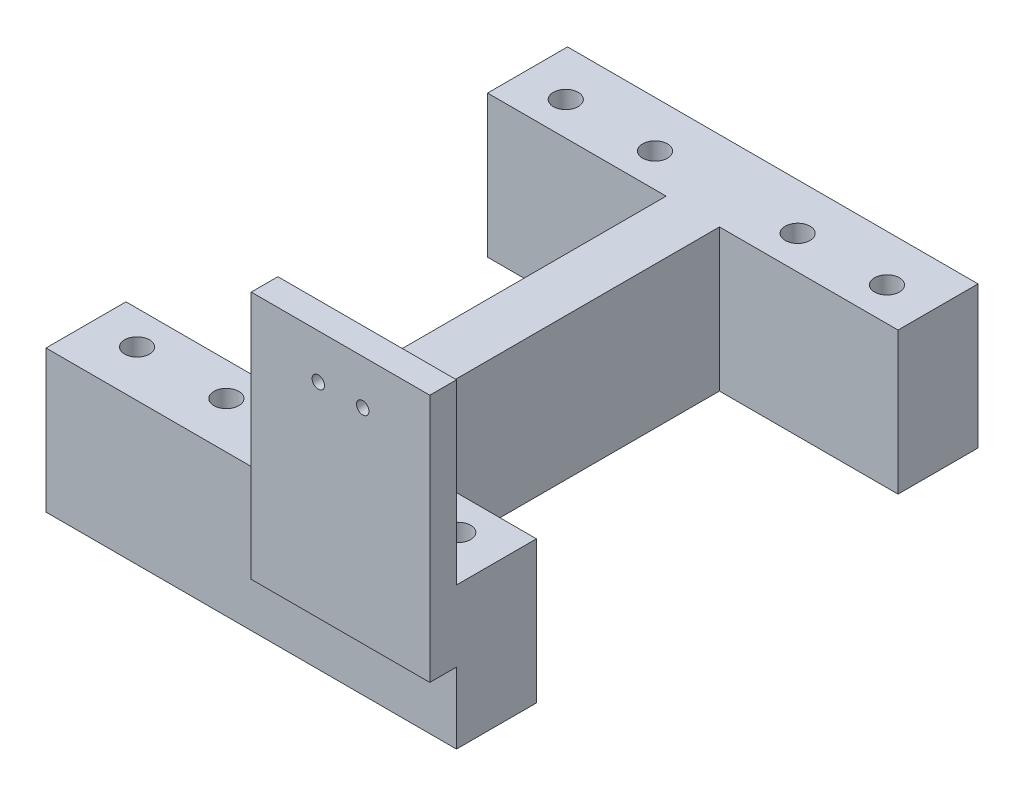
ISO-10303-21;
HEADER;
FILE_DESCRIPTION(('STEP AP214'),'2;1');
FILE_NAME('part.step','',(''),(''),'','','');
FILE_SCHEMA(('AUTOMOTIVE_DESIGN { 1 0 10303 214 1 1 1 1 }'));
ENDSEC;
DATA;
#1=APPLICATION_CONTEXT('core data for automotive mechanical design processes');
#2=APPLICATION_PROTOCOL_DEFINITION('international standard','automotive_design',2000,#1);
#3=PRODUCT_CONTEXT('',#1,'mechanical');
#4=PRODUCT('Part','Part','',(#3));
#5=PRODUCT_RELATED_PRODUCT_CATEGORY('part','',(#4));
#6=PRODUCT_DEFINITION_FORMATION('','',#4);
#7=PRODUCT_DEFINITION_CONTEXT('part definition',#1,'design');
#8=PRODUCT_DEFINITION('design','',#6,#7);
#9=PRODUCT_DEFINITION_SHAPE('','',#8);
#10=(LENGTH_UNIT() NAMED_UNIT(*) SI_UNIT(.MILLI.,.METRE.));
#11=(NAMED_UNIT(*) PLANE_ANGLE_UNIT() SI_UNIT($,.RADIAN.));
#12=(NAMED_UNIT(*) SI_UNIT($,.STERADIAN.) SOLID_ANGLE_UNIT());
#13=UNCERTAINTY_MEASURE_WITH_UNIT(LENGTH_MEASURE(1.E-05),#10,'distance_accuracy_value','');
#14=(GEOMETRIC_REPRESENTATION_CONTEXT(3) GLOBAL_UNCERTAINTY_ASSIGNED_CONTEXT((#13)) GLOBAL_UNIT_ASSIGNED_CONTEXT((#10,
#11,#12)) REPRESENTATION_CONTEXT('',''));
#15=CARTESIAN_POINT('',(0.,0.,0.));
#16=DIRECTION('',(0.,0.,1.));
#17=DIRECTION('',(1.,0.,0.));
#18=AXIS2_PLACEMENT_3D('',#15,#16,#17);
#19=CARTESIAN_POINT('',(0.,-8.,29.35));
#20=DIRECTION('',(0.,0.,1.));
#21=DIRECTION('',(1.,0.,0.));
#22=AXIS2_PLACEMENT_3D('',#19,#20,#21);
#23=PLANE('',#22);
#24=DIRECTION('',(0.,1.,0.));
#25=VECTOR('',#24,1.);
#26=CARTESIAN_POINT('',(10.05,-8.,29.35));
#27=LINE('',#26,#25);
#28=CARTESIAN_POINT('',(10.05,-8.,29.35));
#29=VERTEX_POINT('',#28);
#30=CARTESIAN_POINT('',(10.05,0.,29.35));
#31=VERTEX_POINT('',#30);
#32=EDGE_CURVE('E57',#29,#31,#27,.T.);
#33=ORIENTED_EDGE('',*,*,#32,.T.);
#34=DIRECTION('',(-1.,0.,0.));
#35=VECTOR('',#34,1.);
#36=CARTESIAN_POINT('',(0.,0.,29.35));
#37=LINE('',#36,#35);
#38=CARTESIAN_POINT('',(-10.05,0.,29.35));
#39=VERTEX_POINT('',#38);
#40=EDGE_CURVE('E348',#31,#39,#37,.T.);
#41=ORIENTED_EDGE('',*,*,#40,.T.);
#42=DIRECTION('',(0.,-1.,0.));
#43=VECTOR('',#42,1.);
#44=CARTESIAN_POINT('',(-10.05,28.,29.35));
#45=LINE('',#44,#43);
#46=CARTESIAN_POINT('',(-10.05,8.,29.35));
#47=VERTEX_POINT('',#46);
#48=EDGE_CURVE('E11',#47,#39,#45,.T.);
#49=ORIENTED_EDGE('',*,*,#48,.F.);
#50=DIRECTION('',(1.,0.,0.));
#51=VECTOR('',#50,1.);
#52=CARTESIAN_POINT('',(0.,8.,29.35));
#53=LINE('',#52,#51);
#54=CARTESIAN_POINT('',(-36.15,8.,29.35));
#55=VERTEX_POINT('',#54);
#56=EDGE_CURVE('E189',#55,#47,#53,.T.);
#57=ORIENTED_EDGE('',*,*,#56,.F.);
#58=DIRECTION('',(0.,1.,0.));
#59=VECTOR('',#58,1.);
#60=CARTESIAN_POINT('',(-36.15,-8.,29.35));
#61=LINE('',#60,#59);
#62=CARTESIAN_POINT('',(-36.15,-8.,29.35));
#63=VERTEX_POINT('',#62);
#64=EDGE_CURVE('E311',#63,#55,#61,.T.);
#65=ORIENTED_EDGE('',*,*,#64,.F.);
#66=DIRECTION('',(1.,0.,0.));
#67=VECTOR('',#66,1.);
#68=CARTESIAN_POINT('',(0.,-8.,29.35));
#69=LINE('',#68,#67);
#70=EDGE_CURVE('E247',#63,#29,#69,.T.);
#71=ORIENTED_EDGE('',*,*,#70,.T.);
#72=EDGE_LOOP('',(#33,#41,#49,#57,#65,#71));
#73=FACE_BOUND('',#72,.T.);
#74=ADVANCED_FACE('F35',(#73),#23,.T.);
#75=CARTESIAN_POINT('',(0.,-8.,20.35));
#76=DIRECTION('',(0.,0.,1.));
#77=DIRECTION('',(1.,0.,0.));
#78=AXIS2_PLACEMENT_3D('',#75,#76,#77);
#79=PLANE('',#78);
#80=DIRECTION('',(0.,1.,0.));
#81=VECTOR('',#80,1.);
#82=CARTESIAN_POINT('',(-36.15,-8.,20.35));
#83=LINE('',#82,#81);
#84=CARTESIAN_POINT('',(-36.15,-8.,20.35));
#85=VERTEX_POINT('',#84);
#86=CARTESIAN_POINT('',(-36.15,8.,20.35));
#87=VERTEX_POINT('',#86);
#88=EDGE_CURVE('E39',#85,#87,#83,.T.);
#89=ORIENTED_EDGE('',*,*,#88,.T.);
#90=DIRECTION('',(1.,0.,0.));
#91=VECTOR('',#90,1.);
#92=CARTESIAN_POINT('',(0.,8.,20.35));
#93=LINE('',#92,#91);
#94=CARTESIAN_POINT('',(-16.05,8.,20.35));
#95=VERTEX_POINT('',#94);
#96=EDGE_CURVE('E179',#87,#95,#93,.T.);
#97=ORIENTED_EDGE('',*,*,#96,.T.);
#98=DIRECTION('',(0.,1.,0.));
#99=VECTOR('',#98,1.);
#100=CARTESIAN_POINT('',(-16.05,-8.,20.35));
#101=LINE('',#100,#99);
#102=CARTESIAN_POINT('',(-16.05,-8.,20.35));
#103=VERTEX_POINT('',#102);
#104=EDGE_CURVE('E44',#103,#95,#101,.T.);
#105=ORIENTED_EDGE('',*,*,#104,.F.);
#106=DIRECTION('',(1.,0.,0.));
#107=VECTOR('',#106,1.);
#108=CARTESIAN_POINT('',(0.,-8.,20.35));
#109=LINE('',#108,#107);
#110=EDGE_CURVE('E241',#85,#103,#109,.T.);
#111=ORIENTED_EDGE('',*,*,#110,.F.);
#112=EDGE_LOOP('',(#89,#97,#105,#111));
#113=FACE_BOUND('',#112,.T.);
#114=ADVANCED_FACE('F37',(#113),#79,.F.);
#115=CARTESIAN_POINT('',(-16.05,-8.,0.));
#116=DIRECTION('',(1.,0.,0.));
#117=DIRECTION('',(0.,0.,-1.));
#118=AXIS2_PLACEMENT_3D('',#115,#116,#117);
#119=PLANE('',#118);
#120=ORIENTED_EDGE('',*,*,#104,.T.);
#121=DIRECTION('',(0.,0.,-1.));
#122=VECTOR('',#121,1.);
#123=CARTESIAN_POINT('',(-16.05,8.,0.));
#124=LINE('',#123,#122);
#125=CARTESIAN_POINT('',(-16.05,8.,-20.35));
#126=VERTEX_POINT('',#125);
#127=EDGE_CURVE('E214',#95,#126,#124,.T.);
#128=ORIENTED_EDGE('',*,*,#127,.T.);
#129=DIRECTION('',(0.,1.,0.));
#130=VECTOR('',#129,1.);
#131=CARTESIAN_POINT('',(-16.05,-8.,-20.35));
#132=LINE('',#131,#130);
#133=CARTESIAN_POINT('',(-16.05,-8.,-20.35));
#134=VERTEX_POINT('',#133);
#135=EDGE_CURVE('E295',#134,#126,#132,.T.);
#136=ORIENTED_EDGE('',*,*,#135,.F.);
#137=DIRECTION('',(0.,0.,-1.));
#138=VECTOR('',#137,1.);
#139=CARTESIAN_POINT('',(-16.05,-8.,0.));
#140=LINE('',#139,#138);
#141=EDGE_CURVE('E268',#103,#134,#140,.T.);
#142=ORIENTED_EDGE('',*,*,#141,.F.);
#143=EDGE_LOOP('',(#120,#128,#136,#142));
#144=FACE_BOUND('',#143,.T.);
#145=ADVANCED_FACE('F328',(#144),#119,.F.);
#146=CARTESIAN_POINT('',(0.,-8.,-20.35));
#147=DIRECTION('',(0.,0.,1.));
#148=DIRECTION('',(1.,0.,0.));
#149=AXIS2_PLACEMENT_3D('',#146,#147,#148);
#150=PLANE('',#149);
#151=ORIENTED_EDGE('',*,*,#135,.T.);
#152=DIRECTION('',(1.,0.,0.));
#153=VECTOR('',#152,1.);
#154=CARTESIAN_POINT('',(0.,8.,-20.35));
#155=LINE('',#154,#153);
#156=CARTESIAN_POINT('',(-36.15,8.,-20.35));
#157=VERTEX_POINT('',#156);
#158=EDGE_CURVE('E211',#157,#126,#155,.T.);
#159=ORIENTED_EDGE('',*,*,#158,.F.);
#160=DIRECTION('',(0.,1.,0.));
#161=VECTOR('',#160,1.);
#162=CARTESIAN_POINT('',(-36.15,-8.,-20.35));
#163=LINE('',#162,#161);
#164=CARTESIAN_POINT('',(-36.15,-8.,-20.35));
#165=VERTEX_POINT('',#164);
#166=EDGE_CURVE('E297',#165,#157,#163,.T.);
#167=ORIENTED_EDGE('',*,*,#166,.F.);
#168=DIRECTION('',(1.,0.,0.));
#169=VECTOR('',#168,1.);
#170=CARTESIAN_POINT('',(0.,-8.,-20.35));
#171=LINE('',#170,#169);
#172=EDGE_CURVE('E265',#165,#134,#171,.T.);
#173=ORIENTED_EDGE('',*,*,#172,.T.);
#174=EDGE_LOOP('',(#151,#159,#167,#173));
#175=FACE_BOUND('',#174,.T.);
#176=ADVANCED_FACE('F421',(#175),#150,.T.);
#177=CARTESIAN_POINT('',(-36.15,-8.,0.));
#178=DIRECTION('',(1.,0.,0.));
#179=DIRECTION('',(0.,0.,-1.));
#180=AXIS2_PLACEMENT_3D('',#177,#178,#179);
#181=PLANE('',#180);
#182=ORIENTED_EDGE('',*,*,#166,.T.);
#183=DIRECTION('',(0.,0.,-1.));
#184=VECTOR('',#183,1.);
#185=CARTESIAN_POINT('',(-36.15,8.,0.));
#186=LINE('',#185,#184);
#187=CARTESIAN_POINT('',(-36.15,8.,-29.35));
#188=VERTEX_POINT('',#187);
#189=EDGE_CURVE('E208',#157,#188,#186,.T.);
#190=ORIENTED_EDGE('',*,*,#189,.T.);
#191=DIRECTION('',(0.,1.,0.));
#192=VECTOR('',#191,1.);
#193=CARTESIAN_POINT('',(-36.15,-8.,-29.35));
#194=LINE('',#193,#192);
#195=CARTESIAN_POINT('',(-36.15,-8.,-29.35));
#196=VERTEX_POINT('',#195);
#197=EDGE_CURVE('E299',#196,#188,#194,.T.);
#198=ORIENTED_EDGE('',*,*,#197,.F.);
#199=DIRECTION('',(0.,0.,-1.));
#200=VECTOR('',#199,1.);
#201=CARTESIAN_POINT('',(-36.15,-8.,0.));
#202=LINE('',#201,#200);
#203=EDGE_CURVE('E263',#165,#196,#202,.T.);
#204=ORIENTED_EDGE('',*,*,#203,.F.);
#205=EDGE_LOOP('',(#182,#190,#198,#204));
#206=FACE_BOUND('',#205,.T.);
#207=ADVANCED_FACE('F424',(#206),#181,.F.);
#208=CARTESIAN_POINT('',(0.,-8.,-29.35));
#209=DIRECTION('',(0.,0.,1.));
#210=DIRECTION('',(1.,0.,0.));
#211=AXIS2_PLACEMENT_3D('',#208,#209,#210);
#212=PLANE('',#211);
#213=ORIENTED_EDGE('',*,*,#197,.T.);
#214=DIRECTION('',(1.,0.,0.));
#215=VECTOR('',#214,1.);
#216=CARTESIAN_POINT('',(0.,8.,-29.35));
#217=LINE('',#216,#215);
#218=CARTESIAN_POINT('',(10.05,8.,-29.35));
#219=VERTEX_POINT('',#218);
#220=EDGE_CURVE('E205',#188,#219,#217,.T.);
#221=ORIENTED_EDGE('',*,*,#220,.T.);
#222=DIRECTION('',(0.,1.,0.));
#223=VECTOR('',#222,1.);
#224=CARTESIAN_POINT('',(10.05,-8.,-29.35));
#225=LINE('',#224,#223);
#226=CARTESIAN_POINT('',(10.05,-8.,-29.35));
#227=VERTEX_POINT('',#226);
#228=EDGE_CURVE('E301',#227,#219,#225,.T.);
#229=ORIENTED_EDGE('',*,*,#228,.F.);
#230=DIRECTION('',(1.,0.,0.));
#231=VECTOR('',#230,1.);
#232=CARTESIAN_POINT('',(0.,-8.,-29.35));
#233=LINE('',#232,#231);
#234=EDGE_CURVE('E261',#196,#227,#233,.T.);
#235=ORIENTED_EDGE('',*,*,#234,.F.);
#236=EDGE_LOOP('',(#213,#221,#229,#235));
#237=FACE_BOUND('',#236,.T.);
#238=ADVANCED_FACE('F428',(#237),#212,.F.);
#239=CARTESIAN_POINT('',(10.05,-8.,0.));
#240=DIRECTION('',(1.,0.,0.));
#241=DIRECTION('',(0.,0.,-1.));
#242=AXIS2_PLACEMENT_3D('',#239,#240,#241);
#243=PLANE('',#242);
#244=ORIENTED_EDGE('',*,*,#228,.T.);
#245=DIRECTION('',(0.,0.,-1.));
#246=VECTOR('',#245,1.);
#247=CARTESIAN_POINT('',(10.05,8.,0.));
#248=LINE('',#247,#246);
#249=CARTESIAN_POINT('',(10.05,8.,-20.35));
#250=VERTEX_POINT('',#249);
#251=EDGE_CURVE('E202',#250,#219,#248,.T.);
#252=ORIENTED_EDGE('',*,*,#251,.F.);
#253=DIRECTION('',(0.,1.,0.));
#254=VECTOR('',#253,1.);
#255=CARTESIAN_POINT('',(10.05,-8.,-20.35));
#256=LINE('',#255,#254);
#257=CARTESIAN_POINT('',(10.05,-8.,-20.35));
#258=VERTEX_POINT('',#257);
#259=EDGE_CURVE('E303',#258,#250,#256,.T.);
#260=ORIENTED_EDGE('',*,*,#259,.F.);
#261=DIRECTION('',(0.,0.,-1.));
#262=VECTOR('',#261,1.);
#263=CARTESIAN_POINT('',(10.05,-8.,0.));
#264=LINE('',#263,#262);
#265=EDGE_CURVE('E258',#258,#227,#264,.T.);
#266=ORIENTED_EDGE('',*,*,#265,.T.);
#267=EDGE_LOOP('',(#244,#252,#260,#266));
#268=FACE_BOUND('',#267,.T.);
#269=ADVANCED_FACE('F432',(#268),#243,.T.);
#270=CARTESIAN_POINT('',(0.,-8.,-20.35));
#271=DIRECTION('',(0.,0.,1.));
#272=DIRECTION('',(1.,0.,0.));
#273=AXIS2_PLACEMENT_3D('',#270,#271,#272);
#274=PLANE('',#273);
#275=ORIENTED_EDGE('',*,*,#259,.T.);
#276=DIRECTION('',(1.,0.,0.));
#277=VECTOR('',#276,1.);
#278=CARTESIAN_POINT('',(0.,8.,-20.35));
#279=LINE('',#278,#277);
#280=CARTESIAN_POINT('',(-10.05,8.,-20.35));
#281=VERTEX_POINT('',#280);
#282=EDGE_CURVE('E199',#281,#250,#279,.T.);
#283=ORIENTED_EDGE('',*,*,#282,.F.);
#284=DIRECTION('',(0.,1.,0.));
#285=VECTOR('',#284,1.);
#286=CARTESIAN_POINT('',(-10.05,-8.,-20.35));
#287=LINE('',#286,#285);
#288=CARTESIAN_POINT('',(-10.05,-8.,-20.35));
#289=VERTEX_POINT('',#288);
#290=EDGE_CURVE('E305',#289,#281,#287,.T.);
#291=ORIENTED_EDGE('',*,*,#290,.F.);
#292=DIRECTION('',(1.,0.,0.));
#293=VECTOR('',#292,1.);
#294=CARTESIAN_POINT('',(0.,-8.,-20.35));
#295=LINE('',#294,#293);
#296=EDGE_CURVE('E255',#289,#258,#295,.T.);
#297=ORIENTED_EDGE('',*,*,#296,.T.);
#298=EDGE_LOOP('',(#275,#283,#291,#297));
#299=FACE_BOUND('',#298,.T.);
#300=ADVANCED_FACE('F436',(#299),#274,.T.);
#301=CARTESIAN_POINT('',(-10.05,-8.,0.));
#302=DIRECTION('',(-1.,0.,0.));
#303=DIRECTION('',(0.,0.,1.));
#304=AXIS2_PLACEMENT_3D('',#301,#302,#303);
#305=PLANE('',#304);
#306=ORIENTED_EDGE('',*,*,#290,.T.);
#307=DIRECTION('',(0.,0.,1.));
#308=VECTOR('',#307,1.);
#309=CARTESIAN_POINT('',(-10.05,8.,0.));
#310=LINE('',#309,#308);
#311=CARTESIAN_POINT('',(-10.05,8.,20.35));
#312=VERTEX_POINT('',#311);
#313=EDGE_CURVE('E196',#281,#312,#310,.T.);
#314=ORIENTED_EDGE('',*,*,#313,.T.);
#315=DIRECTION('',(0.,1.,0.));
#316=VECTOR('',#315,1.);
#317=CARTESIAN_POINT('',(-10.05,-8.,20.35));
#318=LINE('',#317,#316);
#319=CARTESIAN_POINT('',(-10.05,-8.,20.35));
#320=VERTEX_POINT('',#319);
#321=EDGE_CURVE('E307',#320,#312,#318,.T.);
#322=ORIENTED_EDGE('',*,*,#321,.F.);
#323=DIRECTION('',(0.,0.,1.));
#324=VECTOR('',#323,1.);
#325=CARTESIAN_POINT('',(-10.05,-8.,0.));
#326=LINE('',#325,#324);
#327=EDGE_CURVE('E253',#289,#320,#326,.T.);
#328=ORIENTED_EDGE('',*,*,#327,.F.);
#329=EDGE_LOOP('',(#306,#314,#322,#328));
#330=FACE_BOUND('',#329,.T.);
#331=ADVANCED_FACE('F440',(#330),#305,.F.);
#332=CARTESIAN_POINT('',(0.,-8.,20.35));
#333=DIRECTION('',(0.,0.,1.));
#334=DIRECTION('',(1.,0.,0.));
#335=AXIS2_PLACEMENT_3D('',#332,#333,#334);
#336=PLANE('',#335);
#337=ORIENTED_EDGE('',*,*,#321,.T.);
#338=DIRECTION('',(1.,0.,0.));
#339=VECTOR('',#338,1.);
#340=CARTESIAN_POINT('',(0.,8.,20.35));
#341=LINE('',#340,#339);
#342=CARTESIAN_POINT('',(10.05,8.,20.35));
#343=VERTEX_POINT('',#342);
#344=EDGE_CURVE('E193',#312,#343,#341,.T.);
#345=ORIENTED_EDGE('',*,*,#344,.T.);
#346=DIRECTION('',(0.,1.,0.));
#347=VECTOR('',#346,1.);
#348=CARTESIAN_POINT('',(10.05,-8.,20.35));
#349=LINE('',#348,#347);
#350=CARTESIAN_POINT('',(10.05,-8.,20.35));
#351=VERTEX_POINT('',#350);
#352=EDGE_CURVE('E309',#351,#343,#349,.T.);
#353=ORIENTED_EDGE('',*,*,#352,.F.);
#354=DIRECTION('',(1.,0.,0.));
#355=VECTOR('',#354,1.);
#356=CARTESIAN_POINT('',(0.,-8.,20.35));
#357=LINE('',#356,#355);
#358=EDGE_CURVE('E251',#320,#351,#357,.T.);
#359=ORIENTED_EDGE('',*,*,#358,.F.);
#360=EDGE_LOOP('',(#337,#345,#353,#359));
#361=FACE_BOUND('',#360,.T.);
#362=ADVANCED_FACE('F443',(#361),#336,.F.);
#363=CARTESIAN_POINT('',(10.05,-8.,0.));
#364=DIRECTION('',(-1.,0.,0.));
#365=DIRECTION('',(0.,0.,1.));
#366=AXIS2_PLACEMENT_3D('',#363,#364,#365);
#367=PLANE('',#366);
#368=ORIENTED_EDGE('',*,*,#352,.T.);
#369=DIRECTION('',(0.,0.,1.));
#370=VECTOR('',#369,1.);
#371=CARTESIAN_POINT('',(10.05,8.,0.));
#372=LINE('',#371,#370);
#373=CARTESIAN_POINT('',(10.05,8.,29.35));
#374=VERTEX_POINT('',#373);
#375=EDGE_CURVE('E191',#343,#374,#372,.T.);
#376=ORIENTED_EDGE('',*,*,#375,.T.);
#377=DIRECTION('',(0.,-1.,0.));
#378=VECTOR('',#377,1.);
#379=CARTESIAN_POINT('',(10.05,28.,29.35));
#380=LINE('',#379,#378);
#381=CARTESIAN_POINT('',(10.05,28.,29.35));
#382=VERTEX_POINT('',#381);
#383=EDGE_CURVE('E161',#382,#374,#380,.T.);
#384=ORIENTED_EDGE('',*,*,#383,.F.);
#385=DIRECTION('',(0.,0.,-1.));
#386=VECTOR('',#385,1.);
#387=CARTESIAN_POINT('',(10.05,28.,0.));
#388=LINE('',#387,#386);
#389=CARTESIAN_POINT('',(10.05,28.,32.35));
#390=VERTEX_POINT('',#389);
#391=EDGE_CURVE('E153',#390,#382,#388,.T.);
#392=ORIENTED_EDGE('',*,*,#391,.F.);
#393=DIRECTION('',(0.,-1.,0.));
#394=VECTOR('',#393,1.);
#395=CARTESIAN_POINT('',(10.05,28.,32.35));
#396=LINE('',#395,#394);
#397=CARTESIAN_POINT('',(10.05,0.,32.35));
#398=VERTEX_POINT('',#397);
#399=EDGE_CURVE('E157',#390,#398,#396,.T.);
#400=ORIENTED_EDGE('',*,*,#399,.T.);
#401=DIRECTION('',(0.,0.,-1.));
#402=VECTOR('',#401,1.);
#403=CARTESIAN_POINT('',(10.05,0.,0.));
#404=LINE('',#403,#402);
#405=EDGE_CURVE('E350',#398,#31,#404,.T.);
#406=ORIENTED_EDGE('',*,*,#405,.T.);
#407=ORIENTED_EDGE('',*,*,#32,.F.);
#408=DIRECTION('',(0.,0.,1.));
#409=VECTOR('',#408,1.);
#410=CARTESIAN_POINT('',(10.05,-8.,0.));
#411=LINE('',#410,#409);
#412=EDGE_CURVE('E249',#351,#29,#411,.T.);
#413=ORIENTED_EDGE('',*,*,#412,.F.);
#414=EDGE_LOOP('',(#368,#376,#384,#392,#400,#406,#407,#413));
#415=FACE_BOUND('',#414,.T.);
#416=ADVANCED_FACE('F155',(#415),#367,.F.);
#417=CARTESIAN_POINT('',(-31.125,-8.,-24.125));
#418=DIRECTION('',(0.,1.,0.));
#419=DIRECTION('',(0.,0.,1.));
#420=AXIS2_PLACEMENT_3D('',#417,#418,#419);
#421=CYLINDRICAL_SURFACE('',#420,1.4);
#422=CARTESIAN_POINT('',(-31.125,-8.,-24.125));
#423=DIRECTION('',(0.,1.,0.));
#424=DIRECTION('',(0.,0.,1.));
#425=AXIS2_PLACEMENT_3D('',#422,#423,#424);
#426=CIRCLE('',#425,1.4);
#427=CARTESIAN_POINT('',(-31.125,-8.,-22.725));
#428=VERTEX_POINT('',#427);
#429=EDGE_CURVE('E288',#428,#428,#426,.T.);
#430=ORIENTED_EDGE('',*,*,#429,.F.);
#431=EDGE_LOOP('',(#430));
#432=FACE_BOUND('',#431,.T.);
#433=CARTESIAN_POINT('',(-31.125,8.,-24.125));
#434=DIRECTION('',(0.,1.,0.));
#435=DIRECTION('',(0.,0.,1.));
#436=AXIS2_PLACEMENT_3D('',#433,#434,#435);
#437=CIRCLE('',#436,1.4);
#438=CARTESIAN_POINT('',(-31.125,8.,-22.725));
#439=VERTEX_POINT('',#438);
#440=EDGE_CURVE('E235',#439,#439,#437,.T.);
#441=ORIENTED_EDGE('',*,*,#440,.T.);
#442=EDGE_LOOP('',(#441));
#443=FACE_BOUND('',#442,.T.);
#444=ADVANCED_FACE('F450',(#432,#443),#421,.F.);
#445=CARTESIAN_POINT('',(5.025,-8.,-24.125));
#446=DIRECTION('',(0.,1.,0.));
#447=DIRECTION('',(0.,0.,1.));
#448=AXIS2_PLACEMENT_3D('',#445,#446,#447);
#449=CYLINDRICAL_SURFACE('',#448,1.4);
#450=CARTESIAN_POINT('',(5.025,-8.,-24.125));
#451=DIRECTION('',(0.,1.,0.));
#452=DIRECTION('',(0.,0.,1.));
#453=AXIS2_PLACEMENT_3D('',#450,#451,#452);
#454=CIRCLE('',#453,1.4);
#455=CARTESIAN_POINT('',(5.025,-8.,-22.725));
#456=VERTEX_POINT('',#455);
#457=EDGE_CURVE('E285',#456,#456,#454,.F.);
#458=ORIENTED_EDGE('',*,*,#457,.T.);
#459=EDGE_LOOP('',(#458));
#460=FACE_BOUND('',#459,.T.);
#461=CARTESIAN_POINT('',(5.025,8.,-24.125));
#462=DIRECTION('',(0.,1.,0.));
#463=DIRECTION('',(0.,0.,1.));
#464=AXIS2_PLACEMENT_3D('',#461,#462,#463);
#465=CIRCLE('',#464,1.4);
#466=CARTESIAN_POINT('',(5.025,8.,-22.725));
#467=VERTEX_POINT('',#466);
#468=EDGE_CURVE('E232',#467,#467,#465,.F.);
#469=ORIENTED_EDGE('',*,*,#468,.F.);
#470=EDGE_LOOP('',(#469));
#471=FACE_BOUND('',#470,.T.);
#472=ADVANCED_FACE('F590',(#460,#471),#449,.F.);
#473=CARTESIAN_POINT('',(-5.025,-8.,-24.125));
#474=DIRECTION('',(0.,1.,0.));
#475=DIRECTION('',(0.,0.,1.));
#476=AXIS2_PLACEMENT_3D('',#473,#474,#475);
#477=CYLINDRICAL_SURFACE('',#476,1.4);
#478=CARTESIAN_POINT('',(-5.025,-8.,-24.125));
#479=DIRECTION('',(0.,1.,0.));
#480=DIRECTION('',(0.,0.,1.));
#481=AXIS2_PLACEMENT_3D('',#478,#479,#480);
#482=CIRCLE('',#481,1.4);
#483=CARTESIAN_POINT('',(-5.025,-8.,-22.725));
#484=VERTEX_POINT('',#483);
#485=EDGE_CURVE('E282',#484,#484,#482,.T.);
#486=ORIENTED_EDGE('',*,*,#485,.F.);
#487=EDGE_LOOP('',(#486));
#488=FACE_BOUND('',#487,.T.);
#489=CARTESIAN_POINT('',(-5.025,8.,-24.125));
#490=DIRECTION('',(0.,1.,0.));
#491=DIRECTION('',(0.,0.,1.));
#492=AXIS2_PLACEMENT_3D('',#489,#490,#491);
#493=CIRCLE('',#492,1.4);
#494=CARTESIAN_POINT('',(-5.025,8.,-22.725));
#495=VERTEX_POINT('',#494);
#496=EDGE_CURVE('E229',#495,#495,#493,.T.);
#497=ORIENTED_EDGE('',*,*,#496,.T.);
#498=EDGE_LOOP('',(#497));
#499=FACE_BOUND('',#498,.T.);
#500=ADVANCED_FACE('F580',(#488,#499),#477,.F.);
#501=CARTESIAN_POINT('',(-5.025,-8.,24.125));
#502=DIRECTION('',(0.,1.,0.));
#503=DIRECTION('',(0.,0.,1.));
#504=AXIS2_PLACEMENT_3D('',#501,#502,#503);
#505=CYLINDRICAL_SURFACE('',#504,1.4);
#506=CARTESIAN_POINT('',(-5.025,-8.,24.125));
#507=DIRECTION('',(0.,1.,0.));
#508=DIRECTION('',(0.,0.,1.));
#509=AXIS2_PLACEMENT_3D('',#506,#507,#508);
#510=CIRCLE('',#509,1.4);
#511=CARTESIAN_POINT('',(-5.025,-8.,25.525));
#512=VERTEX_POINT('',#511);
#513=EDGE_CURVE('E279',#512,#512,#510,.F.);
#514=ORIENTED_EDGE('',*,*,#513,.T.);
#515=EDGE_LOOP('',(#514));
#516=FACE_BOUND('',#515,.T.);
#517=CARTESIAN_POINT('',(-5.025,8.,24.125));
#518=DIRECTION('',(0.,1.,0.));
#519=DIRECTION('',(0.,0.,1.));
#520=AXIS2_PLACEMENT_3D('',#517,#518,#519);
#521=CIRCLE('',#520,1.4);
#522=CARTESIAN_POINT('',(-5.025,8.,25.525));
#523=VERTEX_POINT('',#522);
#524=EDGE_CURVE('E226',#523,#523,#521,.F.);
#525=ORIENTED_EDGE('',*,*,#524,.F.);
#526=EDGE_LOOP('',(#525));
#527=FACE_BOUND('',#526,.T.);
#528=ADVANCED_FACE('F571',(#516,#527),#505,.F.);
#529=CARTESIAN_POINT('',(5.025,-8.,24.125));
#530=DIRECTION('',(0.,1.,0.));
#531=DIRECTION('',(0.,0.,1.));
#532=AXIS2_PLACEMENT_3D('',#529,#530,#531);
#533=CYLINDRICAL_SURFACE('',#532,1.4);
#534=CARTESIAN_POINT('',(5.025,-8.,24.125));
#535=DIRECTION('',(0.,1.,0.));
#536=DIRECTION('',(0.,0.,1.));
#537=AXIS2_PLACEMENT_3D('',#534,#535,#536);
#538=CIRCLE('',#537,1.4);
#539=CARTESIAN_POINT('',(5.025,-8.,25.525));
#540=VERTEX_POINT('',#539);
#541=EDGE_CURVE('E276',#540,#540,#538,.T.);
#542=ORIENTED_EDGE('',*,*,#541,.F.);
#543=EDGE_LOOP('',(#542));
#544=FACE_BOUND('',#543,.T.);
#545=CARTESIAN_POINT('',(5.025,8.,24.125));
#546=DIRECTION('',(0.,1.,0.));
#547=DIRECTION('',(0.,0.,1.));
#548=AXIS2_PLACEMENT_3D('',#545,#546,#547);
#549=CIRCLE('',#548,1.4);
#550=CARTESIAN_POINT('',(5.025,8.,25.525));
#551=VERTEX_POINT('',#550);
#552=EDGE_CURVE('E223',#551,#551,#549,.T.);
#553=ORIENTED_EDGE('',*,*,#552,.T.);
#554=EDGE_LOOP('',(#553));
#555=FACE_BOUND('',#554,.T.);
#556=ADVANCED_FACE('F412',(#544,#555),#533,.F.);
#557=CARTESIAN_POINT('',(-31.125,-8.,24.125));
#558=DIRECTION('',(0.,1.,0.));
#559=DIRECTION('',(0.,0.,1.));
#560=AXIS2_PLACEMENT_3D('',#557,#558,#559);
#561=CYLINDRICAL_SURFACE('',#560,1.4);
#562=CARTESIAN_POINT('',(-31.125,-8.,24.125));
#563=DIRECTION('',(0.,1.,0.));
#564=DIRECTION('',(0.,0.,1.));
#565=AXIS2_PLACEMENT_3D('',#562,#563,#564);
#566=CIRCLE('',#565,1.4);
#567=CARTESIAN_POINT('',(-31.125,-8.,25.525));
#568=VERTEX_POINT('',#567);
#569=EDGE_CURVE('E273',#568,#568,#566,.F.);
#570=ORIENTED_EDGE('',*,*,#569,.T.);
#571=EDGE_LOOP('',(#570));
#572=FACE_BOUND('',#571,.T.);
#573=CARTESIAN_POINT('',(-31.125,8.,24.125));
#574=DIRECTION('',(0.,1.,0.));
#575=DIRECTION('',(0.,0.,1.));
#576=AXIS2_PLACEMENT_3D('',#573,#574,#575);
#577=CIRCLE('',#576,1.4);
#578=CARTESIAN_POINT('',(-31.125,8.,25.525));
#579=VERTEX_POINT('',#578);
#580=EDGE_CURVE('E220',#579,#579,#577,.F.);
#581=ORIENTED_EDGE('',*,*,#580,.F.);
#582=EDGE_LOOP('',(#581));
#583=FACE_BOUND('',#582,.T.);
#584=ADVANCED_FACE('F406',(#572,#583),#561,.F.);
#585=CARTESIAN_POINT('',(-21.075,-8.,24.125));
#586=DIRECTION('',(0.,1.,0.));
#587=DIRECTION('',(0.,0.,1.));
#588=AXIS2_PLACEMENT_3D('',#585,#586,#587);
#589=CYLINDRICAL_SURFACE('',#588,1.4);
#590=CARTESIAN_POINT('',(-21.075,-8.,24.125));
#591=DIRECTION('',(0.,1.,0.));
#592=DIRECTION('',(0.,0.,1.));
#593=AXIS2_PLACEMENT_3D('',#590,#591,#592);
#594=CIRCLE('',#593,1.4);
#595=CARTESIAN_POINT('',(-21.075,-8.,25.525));
#596=VERTEX_POINT('',#595);
#597=EDGE_CURVE('E270',#596,#596,#594,.T.);
#598=ORIENTED_EDGE('',*,*,#597,.F.);
#599=EDGE_LOOP('',(#598));
#600=FACE_BOUND('',#599,.T.);
#601=CARTESIAN_POINT('',(-21.075,8.,24.125));
#602=DIRECTION('',(0.,1.,0.));
#603=DIRECTION('',(0.,0.,1.));
#604=AXIS2_PLACEMENT_3D('',#601,#602,#603);
#605=CIRCLE('',#604,1.4);
#606=CARTESIAN_POINT('',(-21.075,8.,25.525));
#607=VERTEX_POINT('',#606);
#608=EDGE_CURVE('E217',#607,#607,#605,.T.);
#609=ORIENTED_EDGE('',*,*,#608,.T.);
#610=EDGE_LOOP('',(#609));
#611=FACE_BOUND('',#610,.T.);
#612=ADVANCED_FACE('F399',(#600,#611),#589,.F.);
#613=CARTESIAN_POINT('',(-36.15,-8.,0.));
#614=DIRECTION('',(-1.,0.,0.));
#615=DIRECTION('',(0.,0.,1.));
#616=AXIS2_PLACEMENT_3D('',#613,#614,#615);
#617=PLANE('',#616);
#618=ORIENTED_EDGE('',*,*,#64,.T.);
#619=DIRECTION('',(0.,0.,1.));
#620=VECTOR('',#619,1.);
#621=CARTESIAN_POINT('',(-36.15,8.,0.));
#622=LINE('',#621,#620);
#623=EDGE_CURVE('E182',#87,#55,#622,.T.);
#624=ORIENTED_EDGE('',*,*,#623,.F.);
#625=ORIENTED_EDGE('',*,*,#88,.F.);
#626=DIRECTION('',(0.,0.,1.));
#627=VECTOR('',#626,1.);
#628=CARTESIAN_POINT('',(-36.15,-8.,0.));
#629=LINE('',#628,#627);
#630=EDGE_CURVE('E244',#85,#63,#629,.T.);
#631=ORIENTED_EDGE('',*,*,#630,.T.);
#632=EDGE_LOOP('',(#618,#624,#625,#631));
#633=FACE_BOUND('',#632,.T.);
#634=ADVANCED_FACE('F320',(#633),#617,.T.);
#635=CARTESIAN_POINT('',(-21.075,-8.,-24.125));
#636=DIRECTION('',(0.,1.,0.));
#637=DIRECTION('',(0.,0.,1.));
#638=AXIS2_PLACEMENT_3D('',#635,#636,#637);
#639=CYLINDRICAL_SURFACE('',#638,1.4);
#640=CARTESIAN_POINT('',(-21.075,-8.,-24.125));
#641=DIRECTION('',(0.,1.,0.));
#642=DIRECTION('',(0.,0.,1.));
#643=AXIS2_PLACEMENT_3D('',#640,#641,#642);
#644=CIRCLE('',#643,1.4);
#645=CARTESIAN_POINT('',(-21.075,-8.,-22.725));
#646=VERTEX_POINT('',#645);
#647=EDGE_CURVE('E291',#646,#646,#644,.F.);
#648=ORIENTED_EDGE('',*,*,#647,.T.);
#649=EDGE_LOOP('',(#648));
#650=FACE_BOUND('',#649,.T.);
#651=CARTESIAN_POINT('',(-21.075,8.,-24.125));
#652=DIRECTION('',(0.,1.,0.));
#653=DIRECTION('',(0.,0.,1.));
#654=AXIS2_PLACEMENT_3D('',#651,#652,#653);
#655=CIRCLE('',#654,1.4);
#656=CARTESIAN_POINT('',(-21.075,8.,-22.725));
#657=VERTEX_POINT('',#656);
#658=EDGE_CURVE('E238',#657,#657,#655,.F.);
#659=ORIENTED_EDGE('',*,*,#658,.F.);
#660=EDGE_LOOP('',(#659));
#661=FACE_BOUND('',#660,.T.);
#662=ADVANCED_FACE('F398',(#650,#661),#639,.F.);
#663=CARTESIAN_POINT('',(0.,-8.,0.));
#664=DIRECTION('',(0.,1.,0.));
#665=DIRECTION('',(0.,0.,1.));
#666=AXIS2_PLACEMENT_3D('',#663,#664,#665);
#667=PLANE('',#666);
#668=ORIENTED_EDGE('',*,*,#110,.T.);
#669=ORIENTED_EDGE('',*,*,#141,.T.);
#670=ORIENTED_EDGE('',*,*,#172,.F.);
#671=ORIENTED_EDGE('',*,*,#203,.T.);
#672=ORIENTED_EDGE('',*,*,#234,.T.);
#673=ORIENTED_EDGE('',*,*,#265,.F.);
#674=ORIENTED_EDGE('',*,*,#296,.F.);
#675=ORIENTED_EDGE('',*,*,#327,.T.);
#676=ORIENTED_EDGE('',*,*,#358,.T.);
#677=ORIENTED_EDGE('',*,*,#412,.T.);
#678=ORIENTED_EDGE('',*,*,#70,.F.);
#679=ORIENTED_EDGE('',*,*,#630,.F.);
#680=EDGE_LOOP('',(#668,#669,#670,#671,#672,#673,#674,#675,#676,#677,#678,#679));
#681=FACE_BOUND('',#680,.T.);
#682=ORIENTED_EDGE('',*,*,#597,.T.);
#683=EDGE_LOOP('',(#682));
#684=FACE_BOUND('',#683,.T.);
#685=ORIENTED_EDGE('',*,*,#569,.F.);
#686=EDGE_LOOP('',(#685));
#687=FACE_BOUND('',#686,.T.);
#688=ORIENTED_EDGE('',*,*,#541,.T.);
#689=EDGE_LOOP('',(#688));
#690=FACE_BOUND('',#689,.T.);
#691=ORIENTED_EDGE('',*,*,#513,.F.);
#692=EDGE_LOOP('',(#691));
#693=FACE_BOUND('',#692,.T.);
#694=ORIENTED_EDGE('',*,*,#485,.T.);
#695=EDGE_LOOP('',(#694));
#696=FACE_BOUND('',#695,.T.);
#697=ORIENTED_EDGE('',*,*,#457,.F.);
#698=EDGE_LOOP('',(#697));
#699=FACE_BOUND('',#698,.T.);
#700=ORIENTED_EDGE('',*,*,#429,.T.);
#701=EDGE_LOOP('',(#700));
#702=FACE_BOUND('',#701,.T.);
#703=ORIENTED_EDGE('',*,*,#647,.F.);
#704=EDGE_LOOP('',(#703));
#705=FACE_BOUND('',#704,.T.);
#706=ADVANCED_FACE('F331',(#681,#684,#687,#690,#693,#696,#699,#702,#705),#667,.F.);
#707=CARTESIAN_POINT('',(0.,8.,0.));
#708=DIRECTION('',(0.,1.,0.));
#709=DIRECTION('',(0.,0.,1.));
#710=AXIS2_PLACEMENT_3D('',#707,#708,#709);
#711=PLANE('',#710);
#712=ORIENTED_EDGE('',*,*,#96,.F.);
#713=ORIENTED_EDGE('',*,*,#623,.T.);
#714=ORIENTED_EDGE('',*,*,#56,.T.);
#715=EDGE_CURVE('E188',#47,#374,#53,.T.);
#716=ORIENTED_EDGE('',*,*,#715,.T.);
#717=ORIENTED_EDGE('',*,*,#375,.F.);
#718=ORIENTED_EDGE('',*,*,#344,.F.);
#719=ORIENTED_EDGE('',*,*,#313,.F.);
#720=ORIENTED_EDGE('',*,*,#282,.T.);
#721=ORIENTED_EDGE('',*,*,#251,.T.);
#722=ORIENTED_EDGE('',*,*,#220,.F.);
#723=ORIENTED_EDGE('',*,*,#189,.F.);
#724=ORIENTED_EDGE('',*,*,#158,.T.);
#725=ORIENTED_EDGE('',*,*,#127,.F.);
#726=EDGE_LOOP('',(#712,#713,#714,#716,#717,#718,#719,#720,#721,#722,#723,#724,#725));
#727=FACE_BOUND('',#726,.T.);
#728=ORIENTED_EDGE('',*,*,#608,.F.);
#729=EDGE_LOOP('',(#728));
#730=FACE_BOUND('',#729,.T.);
#731=ORIENTED_EDGE('',*,*,#580,.T.);
#732=EDGE_LOOP('',(#731));
#733=FACE_BOUND('',#732,.T.);
#734=ORIENTED_EDGE('',*,*,#552,.F.);
#735=EDGE_LOOP('',(#734));
#736=FACE_BOUND('',#735,.T.);
#737=ORIENTED_EDGE('',*,*,#524,.T.);
#738=EDGE_LOOP('',(#737));
#739=FACE_BOUND('',#738,.T.);
#740=ORIENTED_EDGE('',*,*,#496,.F.);
#741=EDGE_LOOP('',(#740));
#742=FACE_BOUND('',#741,.T.);
#743=ORIENTED_EDGE('',*,*,#468,.T.);
#744=EDGE_LOOP('',(#743));
#745=FACE_BOUND('',#744,.T.);
#746=ORIENTED_EDGE('',*,*,#440,.F.);
#747=EDGE_LOOP('',(#746));
#748=FACE_BOUND('',#747,.T.);
#749=ORIENTED_EDGE('',*,*,#658,.T.);
#750=EDGE_LOOP('',(#749));
#751=FACE_BOUND('',#750,.T.);
#752=ADVANCED_FACE('F322',(#727,#730,#733,#736,#739,#742,#745,#748,#751),#711,.T.);
#753=CARTESIAN_POINT('',(0.,28.,32.35));
#754=DIRECTION('',(0.,0.,-1.));
#755=DIRECTION('',(-1.,0.,0.));
#756=AXIS2_PLACEMENT_3D('',#753,#754,#755);
#757=PLANE('',#756);
#758=CARTESIAN_POINT('',(2.50000000000001,23.,32.35));
#759=DIRECTION('',(0.,0.,-1.));
#760=DIRECTION('',(-1.,0.,0.));
#761=AXIS2_PLACEMENT_3D('',#758,#759,#760);
#762=CIRCLE('',#761,0.699999999999999);
#763=CARTESIAN_POINT('',(1.80000000000001,23.,32.35));
#764=VERTEX_POINT('',#763);
#765=EDGE_CURVE('E353',#764,#764,#762,.T.);
#766=ORIENTED_EDGE('',*,*,#765,.T.);
#767=EDGE_LOOP('',(#766));
#768=FACE_BOUND('',#767,.T.);
#769=CARTESIAN_POINT('',(-2.49999999999999,23.,32.35));
#770=DIRECTION('',(0.,0.,-1.));
#771=DIRECTION('',(-1.,0.,0.));
#772=AXIS2_PLACEMENT_3D('',#769,#770,#771);
#773=CIRCLE('',#772,0.7);
#774=CARTESIAN_POINT('',(-3.19999999999999,23.,32.35));
#775=VERTEX_POINT('',#774);
#776=EDGE_CURVE('E358',#775,#775,#773,.T.);
#777=ORIENTED_EDGE('',*,*,#776,.T.);
#778=EDGE_LOOP('',(#777));
#779=FACE_BOUND('',#778,.T.);
#780=DIRECTION('',(1.,0.,0.));
#781=VECTOR('',#780,1.);
#782=CARTESIAN_POINT('',(0.,0.,32.35));
#783=LINE('',#782,#781);
#784=CARTESIAN_POINT('',(-10.05,0.,32.35));
#785=VERTEX_POINT('',#784);
#786=EDGE_CURVE('E178',#785,#398,#783,.T.);
#787=ORIENTED_EDGE('',*,*,#786,.T.);
#788=ORIENTED_EDGE('',*,*,#399,.F.);
#789=DIRECTION('',(1.,0.,0.));
#790=VECTOR('',#789,1.);
#791=CARTESIAN_POINT('',(0.,28.,32.35));
#792=LINE('',#791,#790);
#793=CARTESIAN_POINT('',(-10.05,28.,32.35));
#794=VERTEX_POINT('',#793);
#795=EDGE_CURVE('E165',#794,#390,#792,.T.);
#796=ORIENTED_EDGE('',*,*,#795,.F.);
#797=DIRECTION('',(0.,-1.,0.));
#798=VECTOR('',#797,1.);
#799=CARTESIAN_POINT('',(-10.05,28.,32.35));
#800=LINE('',#799,#798);
#801=EDGE_CURVE('E344',#794,#785,#800,.T.);
#802=ORIENTED_EDGE('',*,*,#801,.T.);
#803=EDGE_LOOP('',(#787,#788,#796,#802));
#804=FACE_BOUND('',#803,.T.);
#805=ADVANCED_FACE('F176',(#768,#779,#804),#757,.F.);
#806=CARTESIAN_POINT('',(0.,28.,29.35));
#807=DIRECTION('',(0.,0.,1.));
#808=DIRECTION('',(1.,0.,0.));
#809=AXIS2_PLACEMENT_3D('',#806,#807,#808);
#810=PLANE('',#809);
#811=CARTESIAN_POINT('',(2.50000000000001,23.,29.35));
#812=DIRECTION('',(0.,0.,-1.));
#813=DIRECTION('',(-1.,0.,0.));
#814=AXIS2_PLACEMENT_3D('',#811,#812,#813);
#815=CIRCLE('',#814,0.699999999999999);
#816=CARTESIAN_POINT('',(1.80000000000001,23.,29.35));
#817=VERTEX_POINT('',#816);
#818=EDGE_CURVE('E361',#817,#817,#815,.T.);
#819=ORIENTED_EDGE('',*,*,#818,.F.);
#820=EDGE_LOOP('',(#819));
#821=FACE_BOUND('',#820,.T.);
#822=CARTESIAN_POINT('',(-2.49999999999999,23.,29.35));
#823=DIRECTION('',(0.,0.,-1.));
#824=DIRECTION('',(1.,0.,0.));
#825=AXIS2_PLACEMENT_3D('',#822,#823,#824);
#826=CIRCLE('',#825,0.7);
#827=CARTESIAN_POINT('',(-1.79999999999999,23.,29.35));
#828=VERTEX_POINT('',#827);
#829=EDGE_CURVE('E362',#828,#828,#826,.T.);
#830=ORIENTED_EDGE('',*,*,#829,.F.);
#831=EDGE_LOOP('',(#830));
#832=FACE_BOUND('',#831,.T.);
#833=ORIENTED_EDGE('',*,*,#715,.F.);
#834=CARTESIAN_POINT('',(-10.05,28.,29.35));
#835=VERTEX_POINT('',#834);
#836=EDGE_CURVE('E46',#835,#47,#45,.T.);
#837=ORIENTED_EDGE('',*,*,#836,.F.);
#838=DIRECTION('',(-1.,0.,0.));
#839=VECTOR('',#838,1.);
#840=CARTESIAN_POINT('',(0.,28.,29.35));
#841=LINE('',#840,#839);
#842=EDGE_CURVE('E164',#382,#835,#841,.T.);
#843=ORIENTED_EDGE('',*,*,#842,.F.);
#844=ORIENTED_EDGE('',*,*,#383,.T.);
#845=EDGE_LOOP('',(#833,#837,#843,#844));
#846=FACE_BOUND('',#845,.T.);
#847=ADVANCED_FACE('F340',(#821,#832,#846),#810,.F.);
#848=CARTESIAN_POINT('',(-10.05,28.,0.));
#849=DIRECTION('',(1.,0.,0.));
#850=DIRECTION('',(0.,0.,-1.));
#851=AXIS2_PLACEMENT_3D('',#848,#849,#850);
#852=PLANE('',#851);
#853=DIRECTION('',(0.,0.,1.));
#854=VECTOR('',#853,1.);
#855=CARTESIAN_POINT('',(-10.05,0.,0.));
#856=LINE('',#855,#854);
#857=EDGE_CURVE('E174',#39,#785,#856,.T.);
#858=ORIENTED_EDGE('',*,*,#857,.T.);
#859=ORIENTED_EDGE('',*,*,#801,.F.);
#860=DIRECTION('',(0.,0.,1.));
#861=VECTOR('',#860,1.);
#862=CARTESIAN_POINT('',(-10.05,28.,0.));
#863=LINE('',#862,#861);
#864=EDGE_CURVE('E170',#835,#794,#863,.T.);
#865=ORIENTED_EDGE('',*,*,#864,.F.);
#866=ORIENTED_EDGE('',*,*,#836,.T.);
#867=ORIENTED_EDGE('',*,*,#48,.T.);
#868=EDGE_LOOP('',(#858,#859,#865,#866,#867));
#869=FACE_BOUND('',#868,.T.);
#870=ADVANCED_FACE('F342',(#869),#852,.F.);
#871=CARTESIAN_POINT('',(0.,28.,0.));
#872=DIRECTION('',(0.,1.,0.));
#873=DIRECTION('',(0.,0.,1.));
#874=AXIS2_PLACEMENT_3D('',#871,#872,#873);
#875=PLANE('',#874);
#876=ORIENTED_EDGE('',*,*,#795,.T.);
#877=ORIENTED_EDGE('',*,*,#391,.T.);
#878=ORIENTED_EDGE('',*,*,#842,.T.);
#879=ORIENTED_EDGE('',*,*,#864,.T.);
#880=EDGE_LOOP('',(#876,#877,#878,#879));
#881=FACE_BOUND('',#880,.T.);
#882=ADVANCED_FACE('F168',(#881),#875,.T.);
#883=CARTESIAN_POINT('',(0.,0.,0.));
#884=DIRECTION('',(0.,1.,0.));
#885=DIRECTION('',(0.,0.,1.));
#886=AXIS2_PLACEMENT_3D('',#883,#884,#885);
#887=PLANE('',#886);
#888=ORIENTED_EDGE('',*,*,#786,.F.);
#889=ORIENTED_EDGE('',*,*,#857,.F.);
#890=ORIENTED_EDGE('',*,*,#40,.F.);
#891=ORIENTED_EDGE('',*,*,#405,.F.);
#892=EDGE_LOOP('',(#888,#889,#890,#891));
#893=FACE_BOUND('',#892,.T.);
#894=ADVANCED_FACE('F379',(#893),#887,.F.);
#895=CARTESIAN_POINT('',(-2.49999999999998,23.,57.35));
#896=DIRECTION('',(0.,0.,-1.));
#897=DIRECTION('',(-1.,0.,0.));
#898=AXIS2_PLACEMENT_3D('',#895,#896,#897);
#899=CYLINDRICAL_SURFACE('',#898,0.7);
#900=ORIENTED_EDGE('',*,*,#829,.T.);
#901=EDGE_LOOP('',(#900));
#902=FACE_BOUND('',#901,.T.);
#903=ORIENTED_EDGE('',*,*,#776,.F.);
#904=EDGE_LOOP('',(#903));
#905=FACE_BOUND('',#904,.T.);
#906=ADVANCED_FACE('F376',(#902,#905),#899,.F.);
#907=CARTESIAN_POINT('',(2.50000000000002,23.,57.35));
#908=DIRECTION('',(0.,0.,-1.));
#909=DIRECTION('',(-1.,0.,0.));
#910=AXIS2_PLACEMENT_3D('',#907,#908,#909);
#911=CYLINDRICAL_SURFACE('',#910,0.699999999999999);
#912=ORIENTED_EDGE('',*,*,#818,.T.);
#913=EDGE_LOOP('',(#912));
#914=FACE_BOUND('',#913,.T.);
#915=ORIENTED_EDGE('',*,*,#765,.F.);
#916=EDGE_LOOP('',(#915));
#917=FACE_BOUND('',#916,.T.);
#918=ADVANCED_FACE('F368',(#914,#917),#911,.F.);
#919=CLOSED_SHELL('',(#74,#114,#145,#176,#207,#238,#269,#300,#331,#362,#416,#444,#472,#500,#528,
#556,#584,#612,#634,#662,#706,#752,#805,#847,#870,#882,#894,#906,#918));
#920=MANIFOLD_SOLID_BREP('B2',#919);
#921=ADVANCED_BREP_SHAPE_REPRESENTATION('',(#18,#920),#14);
#922=SHAPE_DEFINITION_REPRESENTATION(#9,#921);
ENDSEC;
END-ISO-10303-21;
